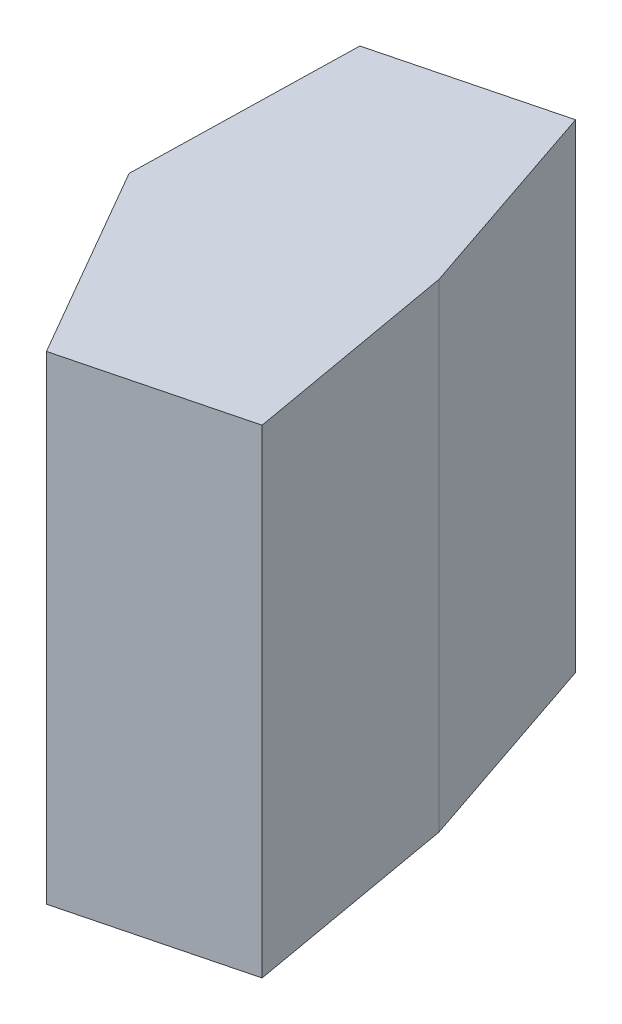
ISO-10303-21;
HEADER;
FILE_DESCRIPTION(('STEP AP214'),'2;1');
FILE_NAME('part.step','',(''),(''),'','','');
FILE_SCHEMA(('AUTOMOTIVE_DESIGN { 1 0 10303 214 1 1 1 1 }'));
ENDSEC;
DATA;
#1=APPLICATION_CONTEXT('core data for automotive mechanical design processes');
#2=APPLICATION_PROTOCOL_DEFINITION('international standard','automotive_design',2000,#1);
#3=PRODUCT_CONTEXT('',#1,'mechanical');
#4=PRODUCT('Part','Part','',(#3));
#5=PRODUCT_RELATED_PRODUCT_CATEGORY('part','',(#4));
#6=PRODUCT_DEFINITION_FORMATION('','',#4);
#7=PRODUCT_DEFINITION_CONTEXT('part definition',#1,'design');
#8=PRODUCT_DEFINITION('design','',#6,#7);
#9=PRODUCT_DEFINITION_SHAPE('','',#8);
#10=(LENGTH_UNIT() NAMED_UNIT(*) SI_UNIT(.MILLI.,.METRE.));
#11=(NAMED_UNIT(*) PLANE_ANGLE_UNIT() SI_UNIT($,.RADIAN.));
#12=(NAMED_UNIT(*) SI_UNIT($,.STERADIAN.) SOLID_ANGLE_UNIT());
#13=UNCERTAINTY_MEASURE_WITH_UNIT(LENGTH_MEASURE(1.E-05),#10,'distance_accuracy_value','');
#14=(GEOMETRIC_REPRESENTATION_CONTEXT(3) GLOBAL_UNCERTAINTY_ASSIGNED_CONTEXT((#13)) GLOBAL_UNIT_ASSIGNED_CONTEXT((#10,
#11,#12)) REPRESENTATION_CONTEXT('',''));
#15=CARTESIAN_POINT('',(0.,0.,0.));
#16=DIRECTION('',(0.,0.,1.));
#17=DIRECTION('',(1.,0.,0.));
#18=AXIS2_PLACEMENT_3D('',#15,#16,#17);
#19=CARTESIAN_POINT('',(-7.0156967512162,6.5,-12.1515432236024));
#20=DIRECTION('',(-0.247806236116151,0.,-0.968809614600282));
#21=DIRECTION('',(-0.968809614600282,0.,0.247806236116151));
#22=AXIS2_PLACEMENT_3D('',#19,#20,#21);
#23=PLANE('',#22);
#24=DIRECTION('',(0.968809614600282,0.,-0.247806236116151));
#25=VECTOR('',#24,1.);
#26=CARTESIAN_POINT('',(-7.0156967512162,-6.5,-12.1515432236024));
#27=LINE('',#26,#25);
#28=CARTESIAN_POINT('',(-7.0156967512162,-6.5,-12.1515432236024));
#29=VERTEX_POINT('',#28);
#30=CARTESIAN_POINT('',(-2.35294288432885,-6.5,-13.3442022024938));
#31=VERTEX_POINT('',#30);
#32=EDGE_CURVE('E114',#29,#31,#27,.T.);
#33=ORIENTED_EDGE('',*,*,#32,.T.);
#34=DIRECTION('',(0.,-1.,0.));
#35=VECTOR('',#34,1.);
#36=CARTESIAN_POINT('',(-2.35294288432885,6.5,-13.3442022024938));
#37=LINE('',#36,#35);
#38=CARTESIAN_POINT('',(-2.35294288432885,6.5,-13.3442022024938));
#39=VERTEX_POINT('',#38);
#40=EDGE_CURVE('E11',#39,#31,#37,.T.);
#41=ORIENTED_EDGE('',*,*,#40,.F.);
#42=DIRECTION('',(0.968809614600282,0.,-0.247806236116151));
#43=VECTOR('',#42,1.);
#44=CARTESIAN_POINT('',(-7.0156967512162,6.5,-12.1515432236024));
#45=LINE('',#44,#43);
#46=CARTESIAN_POINT('',(-7.0156967512162,6.5,-12.1515432236024));
#47=VERTEX_POINT('',#46);
#48=EDGE_CURVE('E131',#47,#39,#45,.T.);
#49=ORIENTED_EDGE('',*,*,#48,.F.);
#50=DIRECTION('',(0.,-1.,0.));
#51=VECTOR('',#50,1.);
#52=CARTESIAN_POINT('',(-7.0156967512162,6.5,-12.1515432236024));
#53=LINE('',#52,#51);
#54=EDGE_CURVE('E47',#47,#29,#53,.T.);
#55=ORIENTED_EDGE('',*,*,#54,.T.);
#56=EDGE_LOOP('',(#33,#41,#49,#55));
#57=FACE_BOUND('',#56,.T.);
#58=ADVANCED_FACE('F39',(#57),#23,.F.);
#59=CARTESIAN_POINT('',(-2.35294288432885,6.5,-13.3442022024938));
#60=DIRECTION('',(-0.98480775301221,0.,0.17364817766692));
#61=DIRECTION('',(0.17364817766692,0.,0.98480775301221));
#62=AXIS2_PLACEMENT_3D('',#59,#60,#61);
#63=PLANE('',#62);
#64=DIRECTION('',(-0.17364817766692,0.,-0.98480775301221));
#65=VECTOR('',#64,1.);
#66=CARTESIAN_POINT('',(-2.35294288432885,-6.5,-13.3442022024938));
#67=LINE('',#66,#65);
#68=CARTESIAN_POINT('',(-3.38108214213551,-6.5,-19.1750696833283));
#69=VERTEX_POINT('',#68);
#70=EDGE_CURVE('E137',#31,#69,#67,.T.);
#71=ORIENTED_EDGE('',*,*,#70,.T.);
#72=DIRECTION('',(0.,-1.,0.));
#73=VECTOR('',#72,1.);
#74=CARTESIAN_POINT('',(-3.38108214213551,6.5,-19.1750696833283));
#75=LINE('',#74,#73);
#76=CARTESIAN_POINT('',(-3.3810821421355,6.5,-19.1750696833283));
#77=VERTEX_POINT('',#76);
#78=EDGE_CURVE('E115',#77,#69,#75,.T.);
#79=ORIENTED_EDGE('',*,*,#78,.F.);
#80=DIRECTION('',(-0.17364817766692,0.,-0.98480775301221));
#81=VECTOR('',#80,1.);
#82=CARTESIAN_POINT('',(-2.35294288432885,6.5,-13.3442022024938));
#83=LINE('',#82,#81);
#84=EDGE_CURVE('E79',#39,#77,#83,.T.);
#85=ORIENTED_EDGE('',*,*,#84,.F.);
#86=ORIENTED_EDGE('',*,*,#40,.T.);
#87=EDGE_LOOP('',(#71,#79,#85,#86));
#88=FACE_BOUND('',#87,.T.);
#89=ADVANCED_FACE('F146',(#88),#63,.F.);
#90=CARTESIAN_POINT('',(-10.0807877289816,6.5,-17.460436526913));
#91=DIRECTION('',(0.866025403784438,0.,-0.500000000000002));
#92=DIRECTION('',(-0.500000000000002,0.,-0.866025403784438));
#93=AXIS2_PLACEMENT_3D('',#90,#91,#92);
#94=PLANE('',#93);
#95=DIRECTION('',(0.500000000000002,0.,0.866025403784438));
#96=VECTOR('',#95,1.);
#97=CARTESIAN_POINT('',(-10.0807877289816,-6.5,-17.460436526913));
#98=LINE('',#97,#96);
#99=CARTESIAN_POINT('',(-10.0807877289816,-6.5,-17.460436526913));
#100=VERTEX_POINT('',#99);
#101=EDGE_CURVE('E72',#100,#29,#98,.T.);
#102=ORIENTED_EDGE('',*,*,#101,.T.);
#103=ORIENTED_EDGE('',*,*,#54,.F.);
#104=DIRECTION('',(0.500000000000002,0.,0.866025403784438));
#105=VECTOR('',#104,1.);
#106=CARTESIAN_POINT('',(-10.0807877289816,6.5,-17.460436526913));
#107=LINE('',#106,#105);
#108=CARTESIAN_POINT('',(-10.0807877289816,6.5,-17.460436526913));
#109=VERTEX_POINT('',#108);
#110=EDGE_CURVE('E55',#109,#47,#107,.T.);
#111=ORIENTED_EDGE('',*,*,#110,.F.);
#112=DIRECTION('',(0.,-1.,0.));
#113=VECTOR('',#112,1.);
#114=CARTESIAN_POINT('',(-10.0807877289816,6.5,-17.460436526913));
#115=LINE('',#114,#113);
#116=EDGE_CURVE('E69',#109,#100,#115,.T.);
#117=ORIENTED_EDGE('',*,*,#116,.T.);
#118=EDGE_LOOP('',(#102,#103,#111,#117));
#119=FACE_BOUND('',#118,.T.);
#120=ADVANCED_FACE('F148',(#119),#94,.F.);
#121=CARTESIAN_POINT('',(0.,6.5,0.));
#122=DIRECTION('',(0.,1.,0.));
#123=DIRECTION('',(0.,0.,1.));
#124=AXIS2_PLACEMENT_3D('',#121,#122,#123);
#125=PLANE('',#124);
#126=ORIENTED_EDGE('',*,*,#48,.T.);
#127=ORIENTED_EDGE('',*,*,#84,.T.);
#128=DIRECTION('',(0.320791262324339,0.,0.947149917392361));
#129=VECTOR('',#128,1.);
#130=CARTESIAN_POINT('',(-5.28042882569035,6.5,-24.7829719727914));
#131=LINE('',#130,#129);
#132=CARTESIAN_POINT('',(-5.28042882569035,6.5,-24.7829719727914));
#133=VERTEX_POINT('',#132);
#134=EDGE_CURVE('E96',#133,#77,#131,.T.);
#135=ORIENTED_EDGE('',*,*,#134,.F.);
#136=DIRECTION('',(0.968743342235254,0.,-0.248065186745074));
#137=VECTOR('',#136,1.);
#138=CARTESIAN_POINT('',(-9.94286373235926,6.5,-23.5890666984172));
#139=LINE('',#138,#137);
#140=CARTESIAN_POINT('',(-9.94286373235926,6.5,-23.5890666984172));
#141=VERTEX_POINT('',#140);
#142=EDGE_CURVE('E100',#141,#133,#139,.T.);
#143=ORIENTED_EDGE('',*,*,#142,.F.);
#144=DIRECTION('',(0.0224991684786647,0.,-0.999746861669377));
#145=VECTOR('',#144,1.);
#146=CARTESIAN_POINT('',(-10.0807877289816,6.5,-17.460436526913));
#147=LINE('',#146,#145);
#148=EDGE_CURVE('E104',#109,#141,#147,.T.);
#149=ORIENTED_EDGE('',*,*,#148,.F.);
#150=ORIENTED_EDGE('',*,*,#110,.T.);
#151=EDGE_LOOP('',(#126,#127,#135,#143,#149,#150));
#152=FACE_BOUND('',#151,.T.);
#153=ADVANCED_FACE('F98',(#152),#125,.T.);
#154=CARTESIAN_POINT('',(0.,-6.5,0.));
#155=DIRECTION('',(0.,1.,0.));
#156=DIRECTION('',(0.,0.,1.));
#157=AXIS2_PLACEMENT_3D('',#154,#155,#156);
#158=PLANE('',#157);
#159=ORIENTED_EDGE('',*,*,#32,.F.);
#160=ORIENTED_EDGE('',*,*,#101,.F.);
#161=DIRECTION('',(0.0224991684786647,0.,-0.999746861669377));
#162=VECTOR('',#161,1.);
#163=CARTESIAN_POINT('',(-10.0807877289816,-6.5,-17.460436526913));
#164=LINE('',#163,#162);
#165=CARTESIAN_POINT('',(-9.94286373235926,-6.5,-23.5890666984172));
#166=VERTEX_POINT('',#165);
#167=EDGE_CURVE('E120',#100,#166,#164,.T.);
#168=ORIENTED_EDGE('',*,*,#167,.T.);
#169=DIRECTION('',(0.968743342235254,0.,-0.248065186745074));
#170=VECTOR('',#169,1.);
#171=CARTESIAN_POINT('',(-9.94286373235926,-6.5,-23.5890666984172));
#172=LINE('',#171,#170);
#173=CARTESIAN_POINT('',(-5.28042882569035,-6.5,-24.7829719727914));
#174=VERTEX_POINT('',#173);
#175=EDGE_CURVE('E125',#166,#174,#172,.T.);
#176=ORIENTED_EDGE('',*,*,#175,.T.);
#177=DIRECTION('',(0.320791262324339,0.,0.947149917392361));
#178=VECTOR('',#177,1.);
#179=CARTESIAN_POINT('',(-5.28042882569035,-6.5,-24.7829719727914));
#180=LINE('',#179,#178);
#181=EDGE_CURVE('E110',#174,#69,#180,.T.);
#182=ORIENTED_EDGE('',*,*,#181,.T.);
#183=ORIENTED_EDGE('',*,*,#70,.F.);
#184=EDGE_LOOP('',(#159,#160,#168,#176,#182,#183));
#185=FACE_BOUND('',#184,.T.);
#186=ADVANCED_FACE('F144',(#185),#158,.F.);
#187=CARTESIAN_POINT('',(-9.94286373235926,6.5,-23.5890666984172));
#188=DIRECTION('',(0.248065186745074,0.,0.968743342235255));
#189=DIRECTION('',(-0.968743342235254,0.,0.248065186745074));
#190=AXIS2_PLACEMENT_3D('',#187,#188,#189);
#191=PLANE('',#190);
#192=ORIENTED_EDGE('',*,*,#175,.F.);
#193=DIRECTION('',(0.,-1.,0.));
#194=VECTOR('',#193,1.);
#195=CARTESIAN_POINT('',(-9.94286373235926,6.5,-23.5890666984172));
#196=LINE('',#195,#194);
#197=EDGE_CURVE('E119',#141,#166,#196,.T.);
#198=ORIENTED_EDGE('',*,*,#197,.F.);
#199=ORIENTED_EDGE('',*,*,#142,.T.);
#200=DIRECTION('',(0.,-1.,0.));
#201=VECTOR('',#200,1.);
#202=CARTESIAN_POINT('',(-5.28042882569035,6.5,-24.7829719727914));
#203=LINE('',#202,#201);
#204=EDGE_CURVE('E107',#133,#174,#203,.T.);
#205=ORIENTED_EDGE('',*,*,#204,.T.);
#206=EDGE_LOOP('',(#192,#198,#199,#205));
#207=FACE_BOUND('',#206,.T.);
#208=ADVANCED_FACE('F117',(#207),#191,.F.);
#209=CARTESIAN_POINT('',(-5.28042882569035,6.5,-24.7829719727914));
#210=DIRECTION('',(-0.947149917392361,0.,0.320791262324339));
#211=DIRECTION('',(-0.320791262324339,0.,-0.947149917392361));
#212=AXIS2_PLACEMENT_3D('',#209,#210,#211);
#213=PLANE('',#212);
#214=ORIENTED_EDGE('',*,*,#181,.F.);
#215=ORIENTED_EDGE('',*,*,#204,.F.);
#216=ORIENTED_EDGE('',*,*,#134,.T.);
#217=ORIENTED_EDGE('',*,*,#78,.T.);
#218=EDGE_LOOP('',(#214,#215,#216,#217));
#219=FACE_BOUND('',#218,.T.);
#220=ADVANCED_FACE('F108',(#219),#213,.F.);
#221=CARTESIAN_POINT('',(-10.0807877289816,6.5,-17.460436526913));
#222=DIRECTION('',(0.999746861669377,0.,0.0224991684786645));
#223=DIRECTION('',(-0.0224991684786647,0.,0.999746861669377));
#224=AXIS2_PLACEMENT_3D('',#221,#222,#223);
#225=PLANE('',#224);
#226=ORIENTED_EDGE('',*,*,#167,.F.);
#227=ORIENTED_EDGE('',*,*,#116,.F.);
#228=ORIENTED_EDGE('',*,*,#148,.T.);
#229=ORIENTED_EDGE('',*,*,#197,.T.);
#230=EDGE_LOOP('',(#226,#227,#228,#229));
#231=FACE_BOUND('',#230,.T.);
#232=ADVANCED_FACE('F164',(#231),#225,.F.);
#233=CLOSED_SHELL('',(#58,#89,#120,#153,#186,#208,#220,#232));
#234=MANIFOLD_SOLID_BREP('B2',#233);
#235=ADVANCED_BREP_SHAPE_REPRESENTATION('',(#18,#234),#14);
#236=SHAPE_DEFINITION_REPRESENTATION(#9,#235);
ENDSEC;
END-ISO-10303-21;
